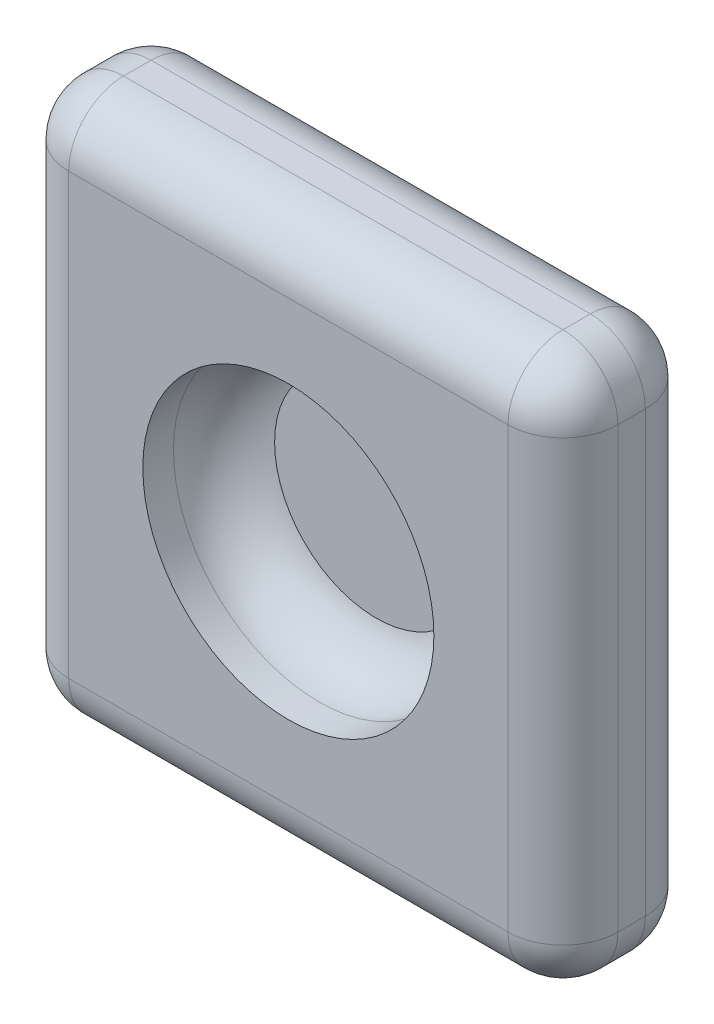
ISO-10303-21;
HEADER;
FILE_DESCRIPTION(('STEP AP214'),'2;1');
FILE_NAME('part.step','',(''),(''),'','','');
FILE_SCHEMA(('AUTOMOTIVE_DESIGN { 1 0 10303 214 1 1 1 1 }'));
ENDSEC;
DATA;
#1=APPLICATION_CONTEXT('core data for automotive mechanical design processes');
#2=APPLICATION_PROTOCOL_DEFINITION('international standard','automotive_design',2000,#1);
#3=PRODUCT_CONTEXT('',#1,'mechanical');
#4=PRODUCT('Part','Part','',(#3));
#5=PRODUCT_RELATED_PRODUCT_CATEGORY('part','',(#4));
#6=PRODUCT_DEFINITION_FORMATION('','',#4);
#7=PRODUCT_DEFINITION_CONTEXT('part definition',#1,'design');
#8=PRODUCT_DEFINITION('design','',#6,#7);
#9=PRODUCT_DEFINITION_SHAPE('','',#8);
#10=(LENGTH_UNIT() NAMED_UNIT(*) SI_UNIT(.MILLI.,.METRE.));
#11=(NAMED_UNIT(*) PLANE_ANGLE_UNIT() SI_UNIT($,.RADIAN.));
#12=(NAMED_UNIT(*) SI_UNIT($,.STERADIAN.) SOLID_ANGLE_UNIT());
#13=UNCERTAINTY_MEASURE_WITH_UNIT(LENGTH_MEASURE(1.E-05),#10,'distance_accuracy_value','');
#14=(GEOMETRIC_REPRESENTATION_CONTEXT(3) GLOBAL_UNCERTAINTY_ASSIGNED_CONTEXT((#13)) GLOBAL_UNIT_ASSIGNED_CONTEXT((#10,
#11,#12)) REPRESENTATION_CONTEXT('',''));
#15=CARTESIAN_POINT('',(0.,0.,0.));
#16=DIRECTION('',(0.,0.,1.));
#17=DIRECTION('',(1.,0.,0.));
#18=AXIS2_PLACEMENT_3D('',#15,#16,#17);
#19=CARTESIAN_POINT('',(50.,50.,25.));
#20=DIRECTION('',(0.,-1.,0.));
#21=DIRECTION('',(1.,0.,0.));
#22=AXIS2_PLACEMENT_3D('',#19,#20,#21);
#23=PLANE('',#22);
#24=DIRECTION('',(-1.,0.,0.));
#25=VECTOR('',#24,1.);
#26=CARTESIAN_POINT('',(50.,50.,15.));
#27=LINE('',#26,#25);
#28=CARTESIAN_POINT('',(-40.,50.,15.));
#29=VERTEX_POINT('',#28);
#30=CARTESIAN_POINT('',(40.,50.,15.));
#31=VERTEX_POINT('',#30);
#32=EDGE_CURVE('E47',#29,#31,#27,.F.);
#33=ORIENTED_EDGE('',*,*,#32,.T.);
#34=DIRECTION('',(0.,0.,-1.));
#35=VECTOR('',#34,1.);
#36=CARTESIAN_POINT('',(40.,50.,25.));
#37=LINE('',#36,#35);
#38=CARTESIAN_POINT('',(40.,50.,10.));
#39=VERTEX_POINT('',#38);
#40=EDGE_CURVE('E11',#31,#39,#37,.T.);
#41=ORIENTED_EDGE('',*,*,#40,.T.);
#42=DIRECTION('',(-1.,0.,0.));
#43=VECTOR('',#42,1.);
#44=CARTESIAN_POINT('',(-50.,50.,10.));
#45=LINE('',#44,#43);
#46=CARTESIAN_POINT('',(-40.,50.,10.));
#47=VERTEX_POINT('',#46);
#48=EDGE_CURVE('E261',#39,#47,#45,.T.);
#49=ORIENTED_EDGE('',*,*,#48,.T.);
#50=DIRECTION('',(0.,0.,-1.));
#51=VECTOR('',#50,1.);
#52=CARTESIAN_POINT('',(-40.,50.,25.));
#53=LINE('',#52,#51);
#54=EDGE_CURVE('E58',#47,#29,#53,.F.);
#55=ORIENTED_EDGE('',*,*,#54,.T.);
#56=EDGE_LOOP('',(#33,#41,#49,#55));
#57=FACE_BOUND('',#56,.T.);
#58=ADVANCED_FACE('F37',(#57),#23,.F.);
#59=CARTESIAN_POINT('',(-50.,-50.,25.));
#60=DIRECTION('',(1.,0.,0.));
#61=DIRECTION('',(0.,1.,0.));
#62=AXIS2_PLACEMENT_3D('',#59,#60,#61);
#63=PLANE('',#62);
#64=DIRECTION('',(0.,0.,-1.));
#65=VECTOR('',#64,1.);
#66=CARTESIAN_POINT('',(-50.,-40.,25.));
#67=LINE('',#66,#65);
#68=CARTESIAN_POINT('',(-50.,-40.,10.));
#69=VERTEX_POINT('',#68);
#70=CARTESIAN_POINT('',(-50.,-40.,15.));
#71=VERTEX_POINT('',#70);
#72=EDGE_CURVE('E258',#69,#71,#67,.F.);
#73=ORIENTED_EDGE('',*,*,#72,.T.);
#74=DIRECTION('',(0.,-1.,0.));
#75=VECTOR('',#74,1.);
#76=CARTESIAN_POINT('',(-50.,-50.,15.));
#77=LINE('',#76,#75);
#78=CARTESIAN_POINT('',(-50.,40.,15.));
#79=VERTEX_POINT('',#78);
#80=EDGE_CURVE('E256',#71,#79,#77,.F.);
#81=ORIENTED_EDGE('',*,*,#80,.T.);
#82=DIRECTION('',(0.,0.,-1.));
#83=VECTOR('',#82,1.);
#84=CARTESIAN_POINT('',(-50.,40.,25.));
#85=LINE('',#84,#83);
#86=CARTESIAN_POINT('',(-50.,40.,10.));
#87=VERTEX_POINT('',#86);
#88=EDGE_CURVE('E252',#79,#87,#85,.T.);
#89=ORIENTED_EDGE('',*,*,#88,.T.);
#90=DIRECTION('',(0.,-1.,0.));
#91=VECTOR('',#90,1.);
#92=CARTESIAN_POINT('',(-50.,-50.,10.));
#93=LINE('',#92,#91);
#94=EDGE_CURVE('E255',#87,#69,#93,.T.);
#95=ORIENTED_EDGE('',*,*,#94,.T.);
#96=EDGE_LOOP('',(#73,#81,#89,#95));
#97=FACE_BOUND('',#96,.T.);
#98=ADVANCED_FACE('F324',(#97),#63,.F.);
#99=CARTESIAN_POINT('',(50.,-50.,25.));
#100=DIRECTION('',(0.,1.,0.));
#101=DIRECTION('',(-1.,0.,0.));
#102=AXIS2_PLACEMENT_3D('',#99,#100,#101);
#103=PLANE('',#102);
#104=DIRECTION('',(1.,0.,0.));
#105=VECTOR('',#104,1.);
#106=CARTESIAN_POINT('',(50.,-50.,10.));
#107=LINE('',#106,#105);
#108=CARTESIAN_POINT('',(-40.,-50.,10.));
#109=VERTEX_POINT('',#108);
#110=CARTESIAN_POINT('',(40.,-50.,10.));
#111=VERTEX_POINT('',#110);
#112=EDGE_CURVE('E229',#109,#111,#107,.T.);
#113=ORIENTED_EDGE('',*,*,#112,.T.);
#114=DIRECTION('',(0.,0.,-1.));
#115=VECTOR('',#114,1.);
#116=CARTESIAN_POINT('',(40.,-50.,25.));
#117=LINE('',#116,#115);
#118=CARTESIAN_POINT('',(40.,-50.,15.));
#119=VERTEX_POINT('',#118);
#120=EDGE_CURVE('E233',#111,#119,#117,.F.);
#121=ORIENTED_EDGE('',*,*,#120,.T.);
#122=DIRECTION('',(1.,0.,0.));
#123=VECTOR('',#122,1.);
#124=CARTESIAN_POINT('',(50.,-50.,15.));
#125=LINE('',#124,#123);
#126=CARTESIAN_POINT('',(-40.,-50.,15.));
#127=VERTEX_POINT('',#126);
#128=EDGE_CURVE('E230',#119,#127,#125,.F.);
#129=ORIENTED_EDGE('',*,*,#128,.T.);
#130=DIRECTION('',(0.,0.,-1.));
#131=VECTOR('',#130,1.);
#132=CARTESIAN_POINT('',(-40.,-50.,25.));
#133=LINE('',#132,#131);
#134=EDGE_CURVE('E226',#127,#109,#133,.T.);
#135=ORIENTED_EDGE('',*,*,#134,.T.);
#136=EDGE_LOOP('',(#113,#121,#129,#135));
#137=FACE_BOUND('',#136,.T.);
#138=ADVANCED_FACE('F295',(#137),#103,.F.);
#139=CARTESIAN_POINT('',(50.,-50.,25.));
#140=DIRECTION('',(-1.,0.,0.));
#141=DIRECTION('',(0.,0.,1.));
#142=AXIS2_PLACEMENT_3D('',#139,#140,#141);
#143=PLANE('',#142);
#144=DIRECTION('',(0.,1.,0.));
#145=VECTOR('',#144,1.);
#146=CARTESIAN_POINT('',(50.,-50.,15.));
#147=LINE('',#146,#145);
#148=CARTESIAN_POINT('',(50.,40.,15.));
#149=VERTEX_POINT('',#148);
#150=CARTESIAN_POINT('',(50.,-40.,15.));
#151=VERTEX_POINT('',#150);
#152=EDGE_CURVE('E161',#149,#151,#147,.F.);
#153=ORIENTED_EDGE('',*,*,#152,.T.);
#154=DIRECTION('',(0.,0.,-1.));
#155=VECTOR('',#154,1.);
#156=CARTESIAN_POINT('',(50.,-40.,25.));
#157=LINE('',#156,#155);
#158=CARTESIAN_POINT('',(50.,-40.,10.));
#159=VERTEX_POINT('',#158);
#160=EDGE_CURVE('E249',#151,#159,#157,.T.);
#161=ORIENTED_EDGE('',*,*,#160,.T.);
#162=DIRECTION('',(0.,1.,0.));
#163=VECTOR('',#162,1.);
#164=CARTESIAN_POINT('',(50.,50.,10.));
#165=LINE('',#164,#163);
#166=CARTESIAN_POINT('',(50.,40.,10.));
#167=VERTEX_POINT('',#166);
#168=EDGE_CURVE('E247',#159,#167,#165,.T.);
#169=ORIENTED_EDGE('',*,*,#168,.T.);
#170=DIRECTION('',(0.,0.,-1.));
#171=VECTOR('',#170,1.);
#172=CARTESIAN_POINT('',(50.,40.,25.));
#173=LINE('',#172,#171);
#174=EDGE_CURVE('E243',#167,#149,#173,.F.);
#175=ORIENTED_EDGE('',*,*,#174,.T.);
#176=EDGE_LOOP('',(#153,#161,#169,#175));
#177=FACE_BOUND('',#176,.T.);
#178=ADVANCED_FACE('F301',(#177),#143,.F.);
#179=CARTESIAN_POINT('',(0.,0.,25.));
#180=DIRECTION('',(0.,0.,-1.));
#181=DIRECTION('',(-1.,0.,0.));
#182=AXIS2_PLACEMENT_3D('',#179,#180,#181);
#183=PLANE('',#182);
#184=DIRECTION('',(0.,-1.,0.));
#185=VECTOR('',#184,1.);
#186=CARTESIAN_POINT('',(-40.,0.,25.));
#187=LINE('',#186,#185);
#188=CARTESIAN_POINT('',(-40.,40.,25.));
#189=VERTEX_POINT('',#188);
#190=CARTESIAN_POINT('',(-40.,-40.,25.));
#191=VERTEX_POINT('',#190);
#192=EDGE_CURVE('E139',#189,#191,#187,.T.);
#193=ORIENTED_EDGE('',*,*,#192,.T.);
#194=DIRECTION('',(1.,0.,0.));
#195=VECTOR('',#194,1.);
#196=CARTESIAN_POINT('',(0.,-40.,25.));
#197=LINE('',#196,#195);
#198=CARTESIAN_POINT('',(40.,-40.,25.));
#199=VERTEX_POINT('',#198);
#200=EDGE_CURVE('E135',#191,#199,#197,.T.);
#201=ORIENTED_EDGE('',*,*,#200,.T.);
#202=DIRECTION('',(0.,1.,0.));
#203=VECTOR('',#202,1.);
#204=CARTESIAN_POINT('',(40.,0.,25.));
#205=LINE('',#204,#203);
#206=CARTESIAN_POINT('',(40.,40.,25.));
#207=VERTEX_POINT('',#206);
#208=EDGE_CURVE('E126',#199,#207,#205,.T.);
#209=ORIENTED_EDGE('',*,*,#208,.T.);
#210=DIRECTION('',(-1.,0.,0.));
#211=VECTOR('',#210,1.);
#212=CARTESIAN_POINT('',(0.,40.,25.));
#213=LINE('',#212,#211);
#214=EDGE_CURVE('E132',#207,#189,#213,.T.);
#215=ORIENTED_EDGE('',*,*,#214,.T.);
#216=EDGE_LOOP('',(#193,#201,#209,#215));
#217=FACE_BOUND('',#216,.T.);
#218=CARTESIAN_POINT('',(0.,0.,25.));
#219=DIRECTION('',(0.,0.,-1.));
#220=DIRECTION('',(-1.,0.,0.));
#221=AXIS2_PLACEMENT_3D('',#218,#219,#220);
#222=CIRCLE('',#221,26.5);
#223=CARTESIAN_POINT('',(-26.5,0.,25.));
#224=VERTEX_POINT('',#223);
#225=EDGE_CURVE('E210',#224,#224,#222,.T.);
#226=ORIENTED_EDGE('',*,*,#225,.T.);
#227=EDGE_LOOP('',(#226));
#228=FACE_BOUND('',#227,.T.);
#229=ADVANCED_FACE('F128',(#217,#228),#183,.F.);
#230=CARTESIAN_POINT('',(0.,0.,0.));
#231=DIRECTION('',(0.,0.,-1.));
#232=DIRECTION('',(-1.,0.,0.));
#233=AXIS2_PLACEMENT_3D('',#230,#231,#232);
#234=PLANE('',#233);
#235=DIRECTION('',(0.,1.,0.));
#236=VECTOR('',#235,1.);
#237=CARTESIAN_POINT('',(40.,-50.,0.));
#238=LINE('',#237,#236);
#239=CARTESIAN_POINT('',(40.,40.,0.));
#240=VERTEX_POINT('',#239);
#241=CARTESIAN_POINT('',(40.,-40.,0.));
#242=VERTEX_POINT('',#241);
#243=EDGE_CURVE('E239',#240,#242,#238,.F.);
#244=ORIENTED_EDGE('',*,*,#243,.T.);
#245=DIRECTION('',(1.,0.,0.));
#246=VECTOR('',#245,1.);
#247=CARTESIAN_POINT('',(-50.,-40.,0.));
#248=LINE('',#247,#246);
#249=CARTESIAN_POINT('',(-40.,-40.,0.));
#250=VERTEX_POINT('',#249);
#251=EDGE_CURVE('E241',#242,#250,#248,.F.);
#252=ORIENTED_EDGE('',*,*,#251,.T.);
#253=DIRECTION('',(0.,-1.,0.));
#254=VECTOR('',#253,1.);
#255=CARTESIAN_POINT('',(-40.,50.,0.));
#256=LINE('',#255,#254);
#257=CARTESIAN_POINT('',(-40.,40.,0.));
#258=VERTEX_POINT('',#257);
#259=EDGE_CURVE('E240',#250,#258,#256,.F.);
#260=ORIENTED_EDGE('',*,*,#259,.T.);
#261=DIRECTION('',(-1.,0.,0.));
#262=VECTOR('',#261,1.);
#263=CARTESIAN_POINT('',(50.,40.,0.));
#264=LINE('',#263,#262);
#265=EDGE_CURVE('E231',#258,#240,#264,.F.);
#266=ORIENTED_EDGE('',*,*,#265,.T.);
#267=EDGE_LOOP('',(#244,#252,#260,#266));
#268=FACE_BOUND('',#267,.T.);
#269=ADVANCED_FACE('F565',(#268),#234,.T.);
#270=CARTESIAN_POINT('',(0.,0.,9.00000000000001));
#271=DIRECTION('',(0.,0.,1.));
#272=DIRECTION('',(1.,0.,0.));
#273=AXIS2_PLACEMENT_3D('',#270,#271,#272);
#274=PLANE('',#273);
#275=CARTESIAN_POINT('',(0.,0.,9.00000000000001));
#276=DIRECTION('',(0.,0.,-1.));
#277=DIRECTION('',(-1.,0.,0.));
#278=AXIS2_PLACEMENT_3D('',#275,#276,#277);
#279=CIRCLE('',#278,18.5);
#280=CARTESIAN_POINT('',(-18.5,0.,9.00000000000001));
#281=VERTEX_POINT('',#280);
#282=EDGE_CURVE('E147',#281,#281,#279,.T.);
#283=ORIENTED_EDGE('',*,*,#282,.F.);
#284=EDGE_LOOP('',(#283));
#285=FACE_BOUND('',#284,.T.);
#286=ADVANCED_FACE('F554',(#285),#274,.T.);
#287=CARTESIAN_POINT('',(0.,0.,19.4190200096846));
#288=DIRECTION('',(0.,0.,-1.));
#289=DIRECTION('',(-1.,0.,0.));
#290=AXIS2_PLACEMENT_3D('',#287,#288,#289);
#291=TOROIDAL_SURFACE('',#290,15.7152513773619,10.7847486226381);
#292=ORIENTED_EDGE('',*,*,#282,.T.);
#293=EDGE_LOOP('',(#292));
#294=FACE_BOUND('',#293,.T.);
#295=CARTESIAN_POINT('',(0.,0.,19.4190200096846));
#296=DIRECTION('',(0.,0.,-1.));
#297=DIRECTION('',(-1.,0.,0.));
#298=AXIS2_PLACEMENT_3D('',#295,#296,#297);
#299=CIRCLE('',#298,26.5);
#300=CARTESIAN_POINT('',(-26.5,0.,19.4190200096846));
#301=VERTEX_POINT('',#300);
#302=EDGE_CURVE('E213',#301,#301,#299,.T.);
#303=ORIENTED_EDGE('',*,*,#302,.F.);
#304=EDGE_LOOP('',(#303));
#305=FACE_BOUND('',#304,.T.);
#306=ADVANCED_FACE('F542',(#294,#305),#291,.F.);
#307=CARTESIAN_POINT('',(0.,0.,0.));
#308=DIRECTION('',(0.,0.,-1.));
#309=DIRECTION('',(-1.,0.,0.));
#310=AXIS2_PLACEMENT_3D('',#307,#308,#309);
#311=CYLINDRICAL_SURFACE('',#310,26.5);
#312=ORIENTED_EDGE('',*,*,#302,.T.);
#313=EDGE_LOOP('',(#312));
#314=FACE_BOUND('',#313,.T.);
#315=ORIENTED_EDGE('',*,*,#225,.F.);
#316=EDGE_LOOP('',(#315));
#317=FACE_BOUND('',#316,.T.);
#318=ADVANCED_FACE('F538',(#314,#317),#311,.F.);
#319=CARTESIAN_POINT('',(50.,40.,10.));
#320=DIRECTION('',(1.,0.,0.));
#321=DIRECTION('',(0.,1.,0.));
#322=AXIS2_PLACEMENT_3D('',#319,#320,#321);
#323=CYLINDRICAL_SURFACE('',#322,10.);
#324=CARTESIAN_POINT('',(-40.,40.,10.));
#325=DIRECTION('',(-1.,0.,0.));
#326=DIRECTION('',(0.,0.,1.));
#327=AXIS2_PLACEMENT_3D('',#324,#325,#326);
#328=CIRCLE('',#327,10.);
#329=EDGE_CURVE('E42',#47,#258,#328,.T.);
#330=ORIENTED_EDGE('',*,*,#329,.F.);
#331=ORIENTED_EDGE('',*,*,#48,.F.);
#332=CARTESIAN_POINT('',(40.,40.,10.));
#333=DIRECTION('',(1.,0.,0.));
#334=DIRECTION('',(0.,0.,-1.));
#335=AXIS2_PLACEMENT_3D('',#332,#333,#334);
#336=CIRCLE('',#335,10.);
#337=EDGE_CURVE('E200',#240,#39,#336,.T.);
#338=ORIENTED_EDGE('',*,*,#337,.F.);
#339=ORIENTED_EDGE('',*,*,#265,.F.);
#340=EDGE_LOOP('',(#330,#331,#338,#339));
#341=FACE_BOUND('',#340,.T.);
#342=ADVANCED_FACE('F45',(#341),#323,.T.);
#343=CARTESIAN_POINT('',(-40.,40.,10.));
#344=DIRECTION('',(0.,0.,-1.));
#345=DIRECTION('',(-1.,0.,0.));
#346=AXIS2_PLACEMENT_3D('',#343,#344,#345);
#347=SPHERICAL_SURFACE('',#346,10.);
#348=CARTESIAN_POINT('',(-40.,40.,10.));
#349=DIRECTION('',(0.,0.,-1.));
#350=DIRECTION('',(-1.,0.,0.));
#351=AXIS2_PLACEMENT_3D('',#348,#349,#350);
#352=CIRCLE('',#351,10.);
#353=EDGE_CURVE('E194',#47,#87,#352,.F.);
#354=ORIENTED_EDGE('',*,*,#353,.F.);
#355=ORIENTED_EDGE('',*,*,#329,.T.);
#356=CARTESIAN_POINT('',(-40.,40.,10.));
#357=DIRECTION('',(0.,1.,0.));
#358=DIRECTION('',(0.,0.,1.));
#359=AXIS2_PLACEMENT_3D('',#356,#357,#358);
#360=CIRCLE('',#359,10.);
#361=EDGE_CURVE('E197',#87,#258,#360,.F.);
#362=ORIENTED_EDGE('',*,*,#361,.F.);
#363=EDGE_LOOP('',(#354,#355,#362));
#364=FACE_BOUND('',#363,.T.);
#365=ADVANCED_FACE('F315',(#364),#347,.T.);
#366=CARTESIAN_POINT('',(40.,40.,10.));
#367=DIRECTION('',(0.,1.,0.));
#368=DIRECTION('',(0.,0.,1.));
#369=AXIS2_PLACEMENT_3D('',#366,#367,#368);
#370=SPHERICAL_SURFACE('',#369,10.);
#371=CARTESIAN_POINT('',(40.,40.,10.));
#372=DIRECTION('',(0.,1.,0.));
#373=DIRECTION('',(0.,0.,1.));
#374=AXIS2_PLACEMENT_3D('',#371,#372,#373);
#375=CIRCLE('',#374,10.);
#376=EDGE_CURVE('E188',#240,#167,#375,.F.);
#377=ORIENTED_EDGE('',*,*,#376,.F.);
#378=ORIENTED_EDGE('',*,*,#337,.T.);
#379=CARTESIAN_POINT('',(40.,40.,10.));
#380=DIRECTION('',(0.,0.,-1.));
#381=DIRECTION('',(-1.,0.,0.));
#382=AXIS2_PLACEMENT_3D('',#379,#380,#381);
#383=CIRCLE('',#382,10.);
#384=EDGE_CURVE('E195',#167,#39,#383,.F.);
#385=ORIENTED_EDGE('',*,*,#384,.F.);
#386=EDGE_LOOP('',(#377,#378,#385));
#387=FACE_BOUND('',#386,.T.);
#388=ADVANCED_FACE('F343',(#387),#370,.T.);
#389=CARTESIAN_POINT('',(-40.,-50.,10.));
#390=DIRECTION('',(0.,1.,0.));
#391=DIRECTION('',(-1.,0.,0.));
#392=AXIS2_PLACEMENT_3D('',#389,#390,#391);
#393=CYLINDRICAL_SURFACE('',#392,10.);
#394=ORIENTED_EDGE('',*,*,#361,.T.);
#395=ORIENTED_EDGE('',*,*,#259,.F.);
#396=CARTESIAN_POINT('',(-40.,-40.,10.));
#397=DIRECTION('',(0.,-1.,0.));
#398=DIRECTION('',(0.,0.,-1.));
#399=AXIS2_PLACEMENT_3D('',#396,#397,#398);
#400=CIRCLE('',#399,10.);
#401=EDGE_CURVE('E184',#69,#250,#400,.T.);
#402=ORIENTED_EDGE('',*,*,#401,.F.);
#403=ORIENTED_EDGE('',*,*,#94,.F.);
#404=EDGE_LOOP('',(#394,#395,#402,#403));
#405=FACE_BOUND('',#404,.T.);
#406=ADVANCED_FACE('F328',(#405),#393,.T.);
#407=CARTESIAN_POINT('',(-40.,40.,25.));
#408=DIRECTION('',(0.,0.,-1.));
#409=DIRECTION('',(-1.,0.,0.));
#410=AXIS2_PLACEMENT_3D('',#407,#408,#409);
#411=CYLINDRICAL_SURFACE('',#410,10.);
#412=ORIENTED_EDGE('',*,*,#353,.T.);
#413=ORIENTED_EDGE('',*,*,#88,.F.);
#414=CARTESIAN_POINT('',(-40.,40.,15.));
#415=DIRECTION('',(0.,0.,1.));
#416=DIRECTION('',(1.,0.,0.));
#417=AXIS2_PLACEMENT_3D('',#414,#415,#416);
#418=CIRCLE('',#417,10.);
#419=EDGE_CURVE('E182',#29,#79,#418,.T.);
#420=ORIENTED_EDGE('',*,*,#419,.F.);
#421=ORIENTED_EDGE('',*,*,#54,.F.);
#422=EDGE_LOOP('',(#412,#413,#420,#421));
#423=FACE_BOUND('',#422,.T.);
#424=ADVANCED_FACE('F320',(#423),#411,.T.);
#425=CARTESIAN_POINT('',(0.,40.,15.));
#426=DIRECTION('',(-1.,0.,0.));
#427=DIRECTION('',(0.,-1.,0.));
#428=AXIS2_PLACEMENT_3D('',#425,#426,#427);
#429=CYLINDRICAL_SURFACE('',#428,10.);
#430=CARTESIAN_POINT('',(40.,40.,15.));
#431=DIRECTION('',(1.,0.,0.));
#432=DIRECTION('',(0.,0.,-1.));
#433=AXIS2_PLACEMENT_3D('',#430,#431,#432);
#434=CIRCLE('',#433,10.);
#435=EDGE_CURVE('E144',#31,#207,#434,.T.);
#436=ORIENTED_EDGE('',*,*,#435,.F.);
#437=ORIENTED_EDGE('',*,*,#32,.F.);
#438=CARTESIAN_POINT('',(-40.,40.,15.));
#439=DIRECTION('',(-1.,0.,0.));
#440=DIRECTION('',(0.,0.,1.));
#441=AXIS2_PLACEMENT_3D('',#438,#439,#440);
#442=CIRCLE('',#441,10.);
#443=EDGE_CURVE('E146',#189,#29,#442,.T.);
#444=ORIENTED_EDGE('',*,*,#443,.F.);
#445=ORIENTED_EDGE('',*,*,#214,.F.);
#446=EDGE_LOOP('',(#436,#437,#444,#445));
#447=FACE_BOUND('',#446,.T.);
#448=ADVANCED_FACE('F145',(#447),#429,.T.);
#449=CARTESIAN_POINT('',(40.,40.,25.));
#450=DIRECTION('',(0.,0.,-1.));
#451=DIRECTION('',(-1.,0.,0.));
#452=AXIS2_PLACEMENT_3D('',#449,#450,#451);
#453=CYLINDRICAL_SURFACE('',#452,10.);
#454=ORIENTED_EDGE('',*,*,#384,.T.);
#455=ORIENTED_EDGE('',*,*,#40,.F.);
#456=CARTESIAN_POINT('',(40.,40.,15.));
#457=DIRECTION('',(0.,0.,1.));
#458=DIRECTION('',(1.,0.,0.));
#459=AXIS2_PLACEMENT_3D('',#456,#457,#458);
#460=CIRCLE('',#459,10.);
#461=EDGE_CURVE('E158',#149,#31,#460,.T.);
#462=ORIENTED_EDGE('',*,*,#461,.F.);
#463=ORIENTED_EDGE('',*,*,#174,.F.);
#464=EDGE_LOOP('',(#454,#455,#462,#463));
#465=FACE_BOUND('',#464,.T.);
#466=ADVANCED_FACE('F310',(#465),#453,.T.);
#467=CARTESIAN_POINT('',(40.,-50.,10.));
#468=DIRECTION('',(0.,-1.,0.));
#469=DIRECTION('',(0.,0.,-1.));
#470=AXIS2_PLACEMENT_3D('',#467,#468,#469);
#471=CYLINDRICAL_SURFACE('',#470,10.);
#472=ORIENTED_EDGE('',*,*,#376,.T.);
#473=ORIENTED_EDGE('',*,*,#168,.F.);
#474=CARTESIAN_POINT('',(40.,-40.,10.));
#475=DIRECTION('',(0.,-1.,0.));
#476=DIRECTION('',(0.,0.,-1.));
#477=AXIS2_PLACEMENT_3D('',#474,#475,#476);
#478=CIRCLE('',#477,10.);
#479=EDGE_CURVE('E177',#242,#159,#478,.T.);
#480=ORIENTED_EDGE('',*,*,#479,.F.);
#481=ORIENTED_EDGE('',*,*,#243,.F.);
#482=EDGE_LOOP('',(#472,#473,#480,#481));
#483=FACE_BOUND('',#482,.T.);
#484=ADVANCED_FACE('F345',(#483),#471,.T.);
#485=CARTESIAN_POINT('',(50.,-40.,10.));
#486=DIRECTION('',(-1.,0.,0.));
#487=DIRECTION('',(0.,-1.,0.));
#488=AXIS2_PLACEMENT_3D('',#485,#486,#487);
#489=CYLINDRICAL_SURFACE('',#488,10.);
#490=CARTESIAN_POINT('',(-40.,-40.,10.));
#491=DIRECTION('',(-1.,0.,0.));
#492=DIRECTION('',(0.,-1.,0.));
#493=AXIS2_PLACEMENT_3D('',#490,#491,#492);
#494=CIRCLE('',#493,10.);
#495=EDGE_CURVE('E186',#250,#109,#494,.T.);
#496=ORIENTED_EDGE('',*,*,#495,.F.);
#497=ORIENTED_EDGE('',*,*,#251,.F.);
#498=CARTESIAN_POINT('',(40.,-40.,10.));
#499=DIRECTION('',(1.,0.,0.));
#500=DIRECTION('',(0.,0.,-1.));
#501=AXIS2_PLACEMENT_3D('',#498,#499,#500);
#502=CIRCLE('',#501,10.);
#503=EDGE_CURVE('E174',#111,#242,#502,.T.);
#504=ORIENTED_EDGE('',*,*,#503,.F.);
#505=ORIENTED_EDGE('',*,*,#112,.F.);
#506=EDGE_LOOP('',(#496,#497,#504,#505));
#507=FACE_BOUND('',#506,.T.);
#508=ADVANCED_FACE('F333',(#507),#489,.T.);
#509=CARTESIAN_POINT('',(-40.,-40.,10.));
#510=DIRECTION('',(0.,0.,-1.));
#511=DIRECTION('',(-1.,0.,0.));
#512=AXIS2_PLACEMENT_3D('',#509,#510,#511);
#513=SPHERICAL_SURFACE('',#512,10.);
#514=ORIENTED_EDGE('',*,*,#401,.T.);
#515=ORIENTED_EDGE('',*,*,#495,.T.);
#516=CARTESIAN_POINT('',(-40.,-40.,10.));
#517=DIRECTION('',(0.,0.,-1.));
#518=DIRECTION('',(-1.,0.,0.));
#519=AXIS2_PLACEMENT_3D('',#516,#517,#518);
#520=CIRCLE('',#519,10.);
#521=EDGE_CURVE('E164',#69,#109,#520,.F.);
#522=ORIENTED_EDGE('',*,*,#521,.F.);
#523=EDGE_LOOP('',(#514,#515,#522));
#524=FACE_BOUND('',#523,.T.);
#525=ADVANCED_FACE('F335',(#524),#513,.T.);
#526=CARTESIAN_POINT('',(-40.,40.,15.));
#527=DIRECTION('',(0.,1.,0.));
#528=DIRECTION('',(0.,0.,1.));
#529=AXIS2_PLACEMENT_3D('',#526,#527,#528);
#530=SPHERICAL_SURFACE('',#529,10.);
#531=ORIENTED_EDGE('',*,*,#443,.T.);
#532=ORIENTED_EDGE('',*,*,#419,.T.);
#533=CARTESIAN_POINT('',(-40.,40.,15.));
#534=DIRECTION('',(0.,1.,0.));
#535=DIRECTION('',(0.,0.,1.));
#536=AXIS2_PLACEMENT_3D('',#533,#534,#535);
#537=CIRCLE('',#536,10.);
#538=EDGE_CURVE('E165',#189,#79,#537,.F.);
#539=ORIENTED_EDGE('',*,*,#538,.F.);
#540=EDGE_LOOP('',(#531,#532,#539));
#541=FACE_BOUND('',#540,.T.);
#542=ADVANCED_FACE('F317',(#541),#530,.T.);
#543=CARTESIAN_POINT('',(40.,40.,15.));
#544=DIRECTION('',(0.,1.,0.));
#545=DIRECTION('',(0.,0.,1.));
#546=AXIS2_PLACEMENT_3D('',#543,#544,#545);
#547=SPHERICAL_SURFACE('',#546,10.);
#548=ORIENTED_EDGE('',*,*,#461,.T.);
#549=ORIENTED_EDGE('',*,*,#435,.T.);
#550=CARTESIAN_POINT('',(40.,40.,15.));
#551=DIRECTION('',(0.,1.,0.));
#552=DIRECTION('',(0.,0.,1.));
#553=AXIS2_PLACEMENT_3D('',#550,#551,#552);
#554=CIRCLE('',#553,10.);
#555=EDGE_CURVE('E154',#149,#207,#554,.F.);
#556=ORIENTED_EDGE('',*,*,#555,.F.);
#557=EDGE_LOOP('',(#548,#549,#556));
#558=FACE_BOUND('',#557,.T.);
#559=ADVANCED_FACE('F152',(#558),#547,.T.);
#560=CARTESIAN_POINT('',(40.,-40.,10.));
#561=DIRECTION('',(0.,0.,-1.));
#562=DIRECTION('',(-1.,0.,0.));
#563=AXIS2_PLACEMENT_3D('',#560,#561,#562);
#564=SPHERICAL_SURFACE('',#563,10.);
#565=ORIENTED_EDGE('',*,*,#503,.T.);
#566=ORIENTED_EDGE('',*,*,#479,.T.);
#567=CARTESIAN_POINT('',(40.,-40.,10.));
#568=DIRECTION('',(0.,0.,-1.));
#569=DIRECTION('',(-1.,0.,0.));
#570=AXIS2_PLACEMENT_3D('',#567,#568,#569);
#571=CIRCLE('',#570,10.);
#572=EDGE_CURVE('E162',#111,#159,#571,.F.);
#573=ORIENTED_EDGE('',*,*,#572,.F.);
#574=EDGE_LOOP('',(#565,#566,#573));
#575=FACE_BOUND('',#574,.T.);
#576=ADVANCED_FACE('F338',(#575),#564,.T.);
#577=CARTESIAN_POINT('',(-40.,-40.,25.));
#578=DIRECTION('',(0.,0.,-1.));
#579=DIRECTION('',(-1.,0.,0.));
#580=AXIS2_PLACEMENT_3D('',#577,#578,#579);
#581=CYLINDRICAL_SURFACE('',#580,10.);
#582=ORIENTED_EDGE('',*,*,#521,.T.);
#583=ORIENTED_EDGE('',*,*,#134,.F.);
#584=CARTESIAN_POINT('',(-40.,-40.,15.));
#585=DIRECTION('',(0.,0.,1.));
#586=DIRECTION('',(1.,0.,0.));
#587=AXIS2_PLACEMENT_3D('',#584,#585,#586);
#588=CIRCLE('',#587,10.);
#589=EDGE_CURVE('E170',#71,#127,#588,.T.);
#590=ORIENTED_EDGE('',*,*,#589,.F.);
#591=ORIENTED_EDGE('',*,*,#72,.F.);
#592=EDGE_LOOP('',(#582,#583,#590,#591));
#593=FACE_BOUND('',#592,.T.);
#594=ADVANCED_FACE('F290',(#593),#581,.T.);
#595=CARTESIAN_POINT('',(-40.,0.,15.));
#596=DIRECTION('',(0.,-1.,0.));
#597=DIRECTION('',(1.,0.,0.));
#598=AXIS2_PLACEMENT_3D('',#595,#596,#597);
#599=CYLINDRICAL_SURFACE('',#598,10.);
#600=ORIENTED_EDGE('',*,*,#538,.T.);
#601=ORIENTED_EDGE('',*,*,#80,.F.);
#602=CARTESIAN_POINT('',(-40.,-40.,15.));
#603=DIRECTION('',(0.,-1.,0.));
#604=DIRECTION('',(0.,0.,-1.));
#605=AXIS2_PLACEMENT_3D('',#602,#603,#604);
#606=CIRCLE('',#605,10.);
#607=EDGE_CURVE('E277',#191,#71,#606,.T.);
#608=ORIENTED_EDGE('',*,*,#607,.F.);
#609=ORIENTED_EDGE('',*,*,#192,.F.);
#610=EDGE_LOOP('',(#600,#601,#608,#609));
#611=FACE_BOUND('',#610,.T.);
#612=ADVANCED_FACE('F323',(#611),#599,.T.);
#613=CARTESIAN_POINT('',(40.,0.,15.));
#614=DIRECTION('',(0.,1.,0.));
#615=DIRECTION('',(0.,0.,1.));
#616=AXIS2_PLACEMENT_3D('',#613,#614,#615);
#617=CYLINDRICAL_SURFACE('',#616,10.);
#618=ORIENTED_EDGE('',*,*,#555,.T.);
#619=ORIENTED_EDGE('',*,*,#208,.F.);
#620=CARTESIAN_POINT('',(40.,-40.,15.));
#621=DIRECTION('',(0.,-1.,0.));
#622=DIRECTION('',(0.,0.,-1.));
#623=AXIS2_PLACEMENT_3D('',#620,#621,#622);
#624=CIRCLE('',#623,10.);
#625=EDGE_CURVE('E272',#151,#199,#624,.T.);
#626=ORIENTED_EDGE('',*,*,#625,.F.);
#627=ORIENTED_EDGE('',*,*,#152,.F.);
#628=EDGE_LOOP('',(#618,#619,#626,#627));
#629=FACE_BOUND('',#628,.T.);
#630=ADVANCED_FACE('F159',(#629),#617,.T.);
#631=CARTESIAN_POINT('',(40.,-40.,25.));
#632=DIRECTION('',(0.,0.,-1.));
#633=DIRECTION('',(-1.,0.,0.));
#634=AXIS2_PLACEMENT_3D('',#631,#632,#633);
#635=CYLINDRICAL_SURFACE('',#634,10.);
#636=ORIENTED_EDGE('',*,*,#572,.T.);
#637=ORIENTED_EDGE('',*,*,#160,.F.);
#638=CARTESIAN_POINT('',(40.,-40.,15.));
#639=DIRECTION('',(0.,0.,1.));
#640=DIRECTION('',(1.,0.,0.));
#641=AXIS2_PLACEMENT_3D('',#638,#639,#640);
#642=CIRCLE('',#641,10.);
#643=EDGE_CURVE('E269',#119,#151,#642,.T.);
#644=ORIENTED_EDGE('',*,*,#643,.F.);
#645=ORIENTED_EDGE('',*,*,#120,.F.);
#646=EDGE_LOOP('',(#636,#637,#644,#645));
#647=FACE_BOUND('',#646,.T.);
#648=ADVANCED_FACE('F305',(#647),#635,.T.);
#649=CARTESIAN_POINT('',(-40.,-40.,15.));
#650=DIRECTION('',(-1.,0.,0.));
#651=DIRECTION('',(0.,0.,1.));
#652=AXIS2_PLACEMENT_3D('',#649,#650,#651);
#653=SPHERICAL_SURFACE('',#652,10.);
#654=ORIENTED_EDGE('',*,*,#607,.T.);
#655=ORIENTED_EDGE('',*,*,#589,.T.);
#656=CARTESIAN_POINT('',(-40.,-40.,15.));
#657=DIRECTION('',(-1.,0.,0.));
#658=DIRECTION('',(0.,0.,1.));
#659=AXIS2_PLACEMENT_3D('',#656,#657,#658);
#660=CIRCLE('',#659,10.);
#661=EDGE_CURVE('E270',#191,#127,#660,.F.);
#662=ORIENTED_EDGE('',*,*,#661,.F.);
#663=EDGE_LOOP('',(#654,#655,#662));
#664=FACE_BOUND('',#663,.T.);
#665=ADVANCED_FACE('F284',(#664),#653,.T.);
#666=CARTESIAN_POINT('',(40.,-40.,15.));
#667=DIRECTION('',(1.,0.,0.));
#668=DIRECTION('',(0.,0.,-1.));
#669=AXIS2_PLACEMENT_3D('',#666,#667,#668);
#670=SPHERICAL_SURFACE('',#669,10.);
#671=ORIENTED_EDGE('',*,*,#643,.T.);
#672=ORIENTED_EDGE('',*,*,#625,.T.);
#673=CARTESIAN_POINT('',(40.,-40.,15.));
#674=DIRECTION('',(1.,0.,0.));
#675=DIRECTION('',(0.,0.,-1.));
#676=AXIS2_PLACEMENT_3D('',#673,#674,#675);
#677=CIRCLE('',#676,10.);
#678=EDGE_CURVE('E264',#119,#199,#677,.F.);
#679=ORIENTED_EDGE('',*,*,#678,.F.);
#680=EDGE_LOOP('',(#671,#672,#679));
#681=FACE_BOUND('',#680,.T.);
#682=ADVANCED_FACE('F298',(#681),#670,.T.);
#683=CARTESIAN_POINT('',(0.,-40.,15.));
#684=DIRECTION('',(1.,0.,0.));
#685=DIRECTION('',(0.,1.,0.));
#686=AXIS2_PLACEMENT_3D('',#683,#684,#685);
#687=CYLINDRICAL_SURFACE('',#686,10.);
#688=ORIENTED_EDGE('',*,*,#661,.T.);
#689=ORIENTED_EDGE('',*,*,#128,.F.);
#690=ORIENTED_EDGE('',*,*,#678,.T.);
#691=ORIENTED_EDGE('',*,*,#200,.F.);
#692=EDGE_LOOP('',(#688,#689,#690,#691));
#693=FACE_BOUND('',#692,.T.);
#694=ADVANCED_FACE('F297',(#693),#687,.T.);
#695=CLOSED_SHELL('',(#58,#98,#138,#178,#229,#269,#286,#306,#318,#342,#365,#388,#406,#424,#448,
#466,#484,#508,#525,#542,#559,#576,#594,#612,#630,#648,#665,#682,#694));
#696=CARTESIAN_POINT('',(0.,0.,5.));
#697=DIRECTION('',(0.,0.,-1.));
#698=DIRECTION('',(-1.,0.,0.));
#699=AXIS2_PLACEMENT_3D('',#696,#697,#698);
#700=CYLINDRICAL_SURFACE('',#699,4.);
#701=CARTESIAN_POINT('',(0.,0.,5.));
#702=DIRECTION('',(0.,0.,-1.));
#703=DIRECTION('',(-1.,0.,0.));
#704=AXIS2_PLACEMENT_3D('',#701,#702,#703);
#705=CIRCLE('',#704,4.);
#706=CARTESIAN_POINT('',(-4.,0.,5.));
#707=VERTEX_POINT('',#706);
#708=EDGE_CURVE('E268',#707,#707,#705,.T.);
#709=ORIENTED_EDGE('',*,*,#708,.F.);
#710=EDGE_LOOP('',(#709));
#711=FACE_BOUND('',#710,.T.);
#712=CARTESIAN_POINT('',(0.,0.,2.));
#713=DIRECTION('',(0.,0.,-1.));
#714=DIRECTION('',(-1.,0.,0.));
#715=AXIS2_PLACEMENT_3D('',#712,#713,#714);
#716=CIRCLE('',#715,4.);
#717=CARTESIAN_POINT('',(-4.,0.,2.));
#718=VERTEX_POINT('',#717);
#719=EDGE_CURVE('E218',#718,#718,#716,.T.);
#720=ORIENTED_EDGE('',*,*,#719,.T.);
#721=EDGE_LOOP('',(#720));
#722=FACE_BOUND('',#721,.T.);
#723=ADVANCED_FACE('F474',(#711,#722),#700,.F.);
#724=CARTESIAN_POINT('',(0.,0.,5.));
#725=DIRECTION('',(0.,0.,-1.));
#726=DIRECTION('',(-1.,0.,0.));
#727=AXIS2_PLACEMENT_3D('',#724,#725,#726);
#728=PLANE('',#727);
#729=ORIENTED_EDGE('',*,*,#708,.T.);
#730=EDGE_LOOP('',(#729));
#731=FACE_BOUND('',#730,.T.);
#732=ADVANCED_FACE('F476',(#731),#728,.T.);
#733=CARTESIAN_POINT('',(0.,0.,2.));
#734=DIRECTION('',(0.,0.,-1.));
#735=DIRECTION('',(-1.,0.,0.));
#736=AXIS2_PLACEMENT_3D('',#733,#734,#735);
#737=PLANE('',#736);
#738=ORIENTED_EDGE('',*,*,#719,.F.);
#739=EDGE_LOOP('',(#738));
#740=FACE_BOUND('',#739,.T.);
#741=ADVANCED_FACE('F488',(#740),#737,.F.);
#742=CLOSED_SHELL('',(#723,#732,#741));
#743=ORIENTED_CLOSED_SHELL('',*,#742,.T.);
#744=BREP_WITH_VOIDS('B2',#695,(#743));
#745=ADVANCED_BREP_SHAPE_REPRESENTATION('',(#18,#744),#14);
#746=SHAPE_DEFINITION_REPRESENTATION(#9,#745);
ENDSEC;
END-ISO-10303-21;
